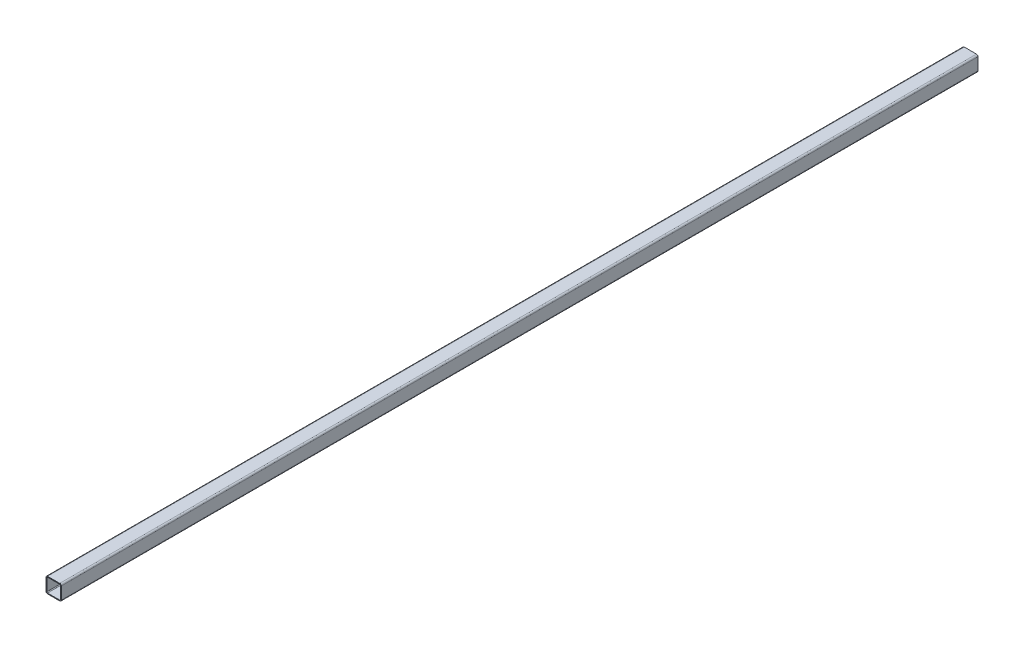
ISO-10303-21;
HEADER;
FILE_DESCRIPTION(('STEP AP214'),'2;1');
FILE_NAME('part.step','',(''),(''),'','','');
FILE_SCHEMA(('AUTOMOTIVE_DESIGN { 1 0 10303 214 1 1 1 1 }'));
ENDSEC;
DATA;
#1=APPLICATION_CONTEXT('core data for automotive mechanical design processes');
#2=APPLICATION_PROTOCOL_DEFINITION('international standard','automotive_design',2000,#1);
#3=PRODUCT_CONTEXT('',#1,'mechanical');
#4=PRODUCT('Part','Part','',(#3));
#5=PRODUCT_RELATED_PRODUCT_CATEGORY('part','',(#4));
#6=PRODUCT_DEFINITION_FORMATION('','',#4);
#7=PRODUCT_DEFINITION_CONTEXT('part definition',#1,'design');
#8=PRODUCT_DEFINITION('design','',#6,#7);
#9=PRODUCT_DEFINITION_SHAPE('','',#8);
#10=(LENGTH_UNIT() NAMED_UNIT(*) SI_UNIT(.MILLI.,.METRE.));
#11=(NAMED_UNIT(*) PLANE_ANGLE_UNIT() SI_UNIT($,.RADIAN.));
#12=(NAMED_UNIT(*) SI_UNIT($,.STERADIAN.) SOLID_ANGLE_UNIT());
#13=UNCERTAINTY_MEASURE_WITH_UNIT(LENGTH_MEASURE(1.E-05),#10,'distance_accuracy_value','');
#14=(GEOMETRIC_REPRESENTATION_CONTEXT(3) GLOBAL_UNCERTAINTY_ASSIGNED_CONTEXT((#13)) GLOBAL_UNIT_ASSIGNED_CONTEXT((#10,
#11,#12)) REPRESENTATION_CONTEXT('',''));
#15=CARTESIAN_POINT('',(0.,0.,0.));
#16=DIRECTION('',(0.,0.,1.));
#17=DIRECTION('',(1.,0.,0.));
#18=AXIS2_PLACEMENT_3D('',#15,#16,#17);
#19=CARTESIAN_POINT('',(-40.,-40.,6000.));
#20=DIRECTION('',(0.,0.,-1.));
#21=DIRECTION('',(-1.,0.,0.));
#22=AXIS2_PLACEMENT_3D('',#19,#20,#21);
#23=CYLINDRICAL_SURFACE('',#22,10.);
#24=CARTESIAN_POINT('',(-40.,-40.,0.));
#25=DIRECTION('',(0.,0.,1.));
#26=DIRECTION('',(1.,0.,0.));
#27=AXIS2_PLACEMENT_3D('',#24,#25,#26);
#28=CIRCLE('',#27,10.);
#29=CARTESIAN_POINT('',(-50.,-40.,0.));
#30=VERTEX_POINT('',#29);
#31=CARTESIAN_POINT('',(-40.,-50.,0.));
#32=VERTEX_POINT('',#31);
#33=EDGE_CURVE('E245',#30,#32,#28,.T.);
#34=ORIENTED_EDGE('',*,*,#33,.T.);
#35=DIRECTION('',(0.,0.,-1.));
#36=VECTOR('',#35,1.);
#37=CARTESIAN_POINT('',(-40.,-50.,6000.));
#38=LINE('',#37,#36);
#39=CARTESIAN_POINT('',(-40.,-50.,6000.));
#40=VERTEX_POINT('',#39);
#41=EDGE_CURVE('E12',#40,#32,#38,.T.);
#42=ORIENTED_EDGE('',*,*,#41,.F.);
#43=CARTESIAN_POINT('',(-40.,-40.,6000.));
#44=DIRECTION('',(0.,0.,1.));
#45=DIRECTION('',(1.,0.,0.));
#46=AXIS2_PLACEMENT_3D('',#43,#44,#45);
#47=CIRCLE('',#46,10.);
#48=CARTESIAN_POINT('',(-50.,-40.,6000.));
#49=VERTEX_POINT('',#48);
#50=EDGE_CURVE('E321',#49,#40,#47,.T.);
#51=ORIENTED_EDGE('',*,*,#50,.F.);
#52=DIRECTION('',(0.,0.,-1.));
#53=VECTOR('',#52,1.);
#54=CARTESIAN_POINT('',(-50.,-40.,6000.));
#55=LINE('',#54,#53);
#56=EDGE_CURVE('E256',#49,#30,#55,.T.);
#57=ORIENTED_EDGE('',*,*,#56,.T.);
#58=EDGE_LOOP('',(#34,#42,#51,#57));
#59=FACE_BOUND('',#58,.T.);
#60=ADVANCED_FACE('F72',(#59),#23,.T.);
#61=CARTESIAN_POINT('',(-40.,-50.,6000.));
#62=DIRECTION('',(0.,1.,0.));
#63=DIRECTION('',(0.,0.,1.));
#64=AXIS2_PLACEMENT_3D('',#61,#62,#63);
#65=PLANE('',#64);
#66=DIRECTION('',(1.,0.,0.));
#67=VECTOR('',#66,1.);
#68=CARTESIAN_POINT('',(-40.,-50.,0.));
#69=LINE('',#68,#67);
#70=CARTESIAN_POINT('',(40.,-50.,0.));
#71=VERTEX_POINT('',#70);
#72=EDGE_CURVE('E247',#32,#71,#69,.T.);
#73=ORIENTED_EDGE('',*,*,#72,.T.);
#74=DIRECTION('',(0.,0.,-1.));
#75=VECTOR('',#74,1.);
#76=CARTESIAN_POINT('',(40.,-50.,6000.));
#77=LINE('',#76,#75);
#78=CARTESIAN_POINT('',(40.,-50.,6000.));
#79=VERTEX_POINT('',#78);
#80=EDGE_CURVE('E83',#79,#71,#77,.T.);
#81=ORIENTED_EDGE('',*,*,#80,.F.);
#82=DIRECTION('',(1.,0.,0.));
#83=VECTOR('',#82,1.);
#84=CARTESIAN_POINT('',(-40.,-50.,6000.));
#85=LINE('',#84,#83);
#86=EDGE_CURVE('E322',#40,#79,#85,.T.);
#87=ORIENTED_EDGE('',*,*,#86,.F.);
#88=ORIENTED_EDGE('',*,*,#41,.T.);
#89=EDGE_LOOP('',(#73,#81,#87,#88));
#90=FACE_BOUND('',#89,.T.);
#91=ADVANCED_FACE('F358',(#90),#65,.F.);
#92=CARTESIAN_POINT('',(40.,-40.,6000.));
#93=DIRECTION('',(0.,0.,-1.));
#94=DIRECTION('',(-1.,0.,0.));
#95=AXIS2_PLACEMENT_3D('',#92,#93,#94);
#96=CYLINDRICAL_SURFACE('',#95,10.);
#97=CARTESIAN_POINT('',(40.,-40.,0.));
#98=DIRECTION('',(0.,0.,1.));
#99=DIRECTION('',(1.,0.,0.));
#100=AXIS2_PLACEMENT_3D('',#97,#98,#99);
#101=CIRCLE('',#100,10.);
#102=CARTESIAN_POINT('',(50.,-40.,0.));
#103=VERTEX_POINT('',#102);
#104=EDGE_CURVE('E246',#71,#103,#101,.T.);
#105=ORIENTED_EDGE('',*,*,#104,.T.);
#106=DIRECTION('',(0.,0.,-1.));
#107=VECTOR('',#106,1.);
#108=CARTESIAN_POINT('',(50.,-40.,6000.));
#109=LINE('',#108,#107);
#110=CARTESIAN_POINT('',(50.,-40.,6000.));
#111=VERTEX_POINT('',#110);
#112=EDGE_CURVE('E262',#111,#103,#109,.T.);
#113=ORIENTED_EDGE('',*,*,#112,.F.);
#114=CARTESIAN_POINT('',(40.,-40.,6000.));
#115=DIRECTION('',(0.,0.,1.));
#116=DIRECTION('',(1.,0.,0.));
#117=AXIS2_PLACEMENT_3D('',#114,#115,#116);
#118=CIRCLE('',#117,10.);
#119=EDGE_CURVE('E324',#79,#111,#118,.T.);
#120=ORIENTED_EDGE('',*,*,#119,.F.);
#121=ORIENTED_EDGE('',*,*,#80,.T.);
#122=EDGE_LOOP('',(#105,#113,#120,#121));
#123=FACE_BOUND('',#122,.T.);
#124=ADVANCED_FACE('F363',(#123),#96,.T.);
#125=CARTESIAN_POINT('',(50.,-40.,6000.));
#126=DIRECTION('',(-1.,0.,0.));
#127=DIRECTION('',(0.,0.,1.));
#128=AXIS2_PLACEMENT_3D('',#125,#126,#127);
#129=PLANE('',#128);
#130=DIRECTION('',(0.,1.,0.));
#131=VECTOR('',#130,1.);
#132=CARTESIAN_POINT('',(50.,-40.,0.));
#133=LINE('',#132,#131);
#134=CARTESIAN_POINT('',(50.,40.,0.));
#135=VERTEX_POINT('',#134);
#136=EDGE_CURVE('E248',#103,#135,#133,.T.);
#137=ORIENTED_EDGE('',*,*,#136,.T.);
#138=DIRECTION('',(0.,0.,-1.));
#139=VECTOR('',#138,1.);
#140=CARTESIAN_POINT('',(50.,40.,6000.));
#141=LINE('',#140,#139);
#142=CARTESIAN_POINT('',(50.,40.,6000.));
#143=VERTEX_POINT('',#142);
#144=EDGE_CURVE('E265',#143,#135,#141,.T.);
#145=ORIENTED_EDGE('',*,*,#144,.F.);
#146=DIRECTION('',(0.,1.,0.));
#147=VECTOR('',#146,1.);
#148=CARTESIAN_POINT('',(50.,-40.,6000.));
#149=LINE('',#148,#147);
#150=EDGE_CURVE('E330',#111,#143,#149,.T.);
#151=ORIENTED_EDGE('',*,*,#150,.F.);
#152=ORIENTED_EDGE('',*,*,#112,.T.);
#153=EDGE_LOOP('',(#137,#145,#151,#152));
#154=FACE_BOUND('',#153,.T.);
#155=ADVANCED_FACE('F335',(#154),#129,.F.);
#156=CARTESIAN_POINT('',(40.,40.,6000.));
#157=DIRECTION('',(0.,0.,-1.));
#158=DIRECTION('',(-1.,0.,0.));
#159=AXIS2_PLACEMENT_3D('',#156,#157,#158);
#160=CYLINDRICAL_SURFACE('',#159,10.);
#161=CARTESIAN_POINT('',(40.,40.,0.));
#162=DIRECTION('',(0.,0.,1.));
#163=DIRECTION('',(1.,0.,0.));
#164=AXIS2_PLACEMENT_3D('',#161,#162,#163);
#165=CIRCLE('',#164,10.);
#166=CARTESIAN_POINT('',(40.,50.,0.));
#167=VERTEX_POINT('',#166);
#168=EDGE_CURVE('E254',#135,#167,#165,.T.);
#169=ORIENTED_EDGE('',*,*,#168,.T.);
#170=DIRECTION('',(0.,0.,-1.));
#171=VECTOR('',#170,1.);
#172=CARTESIAN_POINT('',(40.,50.,6000.));
#173=LINE('',#172,#171);
#174=CARTESIAN_POINT('',(40.,50.,6000.));
#175=VERTEX_POINT('',#174);
#176=EDGE_CURVE('E208',#175,#167,#173,.T.);
#177=ORIENTED_EDGE('',*,*,#176,.F.);
#178=CARTESIAN_POINT('',(40.,40.,6000.));
#179=DIRECTION('',(0.,0.,1.));
#180=DIRECTION('',(1.,0.,0.));
#181=AXIS2_PLACEMENT_3D('',#178,#179,#180);
#182=CIRCLE('',#181,10.);
#183=EDGE_CURVE('E202',#143,#175,#182,.T.);
#184=ORIENTED_EDGE('',*,*,#183,.F.);
#185=ORIENTED_EDGE('',*,*,#144,.T.);
#186=EDGE_LOOP('',(#169,#177,#184,#185));
#187=FACE_BOUND('',#186,.T.);
#188=ADVANCED_FACE('F340',(#187),#160,.T.);
#189=CARTESIAN_POINT('',(40.,50.,6000.));
#190=DIRECTION('',(0.,-1.,0.));
#191=DIRECTION('',(0.,0.,-1.));
#192=AXIS2_PLACEMENT_3D('',#189,#190,#191);
#193=PLANE('',#192);
#194=DIRECTION('',(-1.,0.,0.));
#195=VECTOR('',#194,1.);
#196=CARTESIAN_POINT('',(40.,50.,0.));
#197=LINE('',#196,#195);
#198=CARTESIAN_POINT('',(-40.,50.,0.));
#199=VERTEX_POINT('',#198);
#200=EDGE_CURVE('E206',#167,#199,#197,.T.);
#201=ORIENTED_EDGE('',*,*,#200,.T.);
#202=DIRECTION('',(0.,0.,-1.));
#203=VECTOR('',#202,1.);
#204=CARTESIAN_POINT('',(-40.,50.,6000.));
#205=LINE('',#204,#203);
#206=CARTESIAN_POINT('',(-40.,50.,6000.));
#207=VERTEX_POINT('',#206);
#208=EDGE_CURVE('E207',#207,#199,#205,.T.);
#209=ORIENTED_EDGE('',*,*,#208,.F.);
#210=DIRECTION('',(-1.,0.,0.));
#211=VECTOR('',#210,1.);
#212=CARTESIAN_POINT('',(40.,50.,6000.));
#213=LINE('',#212,#211);
#214=EDGE_CURVE('E193',#175,#207,#213,.T.);
#215=ORIENTED_EDGE('',*,*,#214,.F.);
#216=ORIENTED_EDGE('',*,*,#176,.T.);
#217=EDGE_LOOP('',(#201,#209,#215,#216));
#218=FACE_BOUND('',#217,.T.);
#219=ADVANCED_FACE('F209',(#218),#193,.F.);
#220=CARTESIAN_POINT('',(-40.,40.,6000.));
#221=DIRECTION('',(0.,0.,-1.));
#222=DIRECTION('',(-1.,0.,0.));
#223=AXIS2_PLACEMENT_3D('',#220,#221,#222);
#224=CYLINDRICAL_SURFACE('',#223,10.);
#225=CARTESIAN_POINT('',(-40.,40.,0.));
#226=DIRECTION('',(0.,0.,1.));
#227=DIRECTION('',(1.,0.,0.));
#228=AXIS2_PLACEMENT_3D('',#225,#226,#227);
#229=CIRCLE('',#228,10.);
#230=CARTESIAN_POINT('',(-50.,40.,0.));
#231=VERTEX_POINT('',#230);
#232=EDGE_CURVE('E142',#199,#231,#229,.T.);
#233=ORIENTED_EDGE('',*,*,#232,.T.);
#234=DIRECTION('',(0.,0.,-1.));
#235=VECTOR('',#234,1.);
#236=CARTESIAN_POINT('',(-50.,40.,6000.));
#237=LINE('',#236,#235);
#238=CARTESIAN_POINT('',(-50.,40.,6000.));
#239=VERTEX_POINT('',#238);
#240=EDGE_CURVE('E213',#239,#231,#237,.T.);
#241=ORIENTED_EDGE('',*,*,#240,.F.);
#242=CARTESIAN_POINT('',(-40.,40.,6000.));
#243=DIRECTION('',(0.,0.,1.));
#244=DIRECTION('',(1.,0.,0.));
#245=AXIS2_PLACEMENT_3D('',#242,#243,#244);
#246=CIRCLE('',#245,10.);
#247=EDGE_CURVE('E196',#207,#239,#246,.T.);
#248=ORIENTED_EDGE('',*,*,#247,.F.);
#249=ORIENTED_EDGE('',*,*,#208,.T.);
#250=EDGE_LOOP('',(#233,#241,#248,#249));
#251=FACE_BOUND('',#250,.T.);
#252=ADVANCED_FACE('F211',(#251),#224,.T.);
#253=CARTESIAN_POINT('',(-40.,-40.,6000.));
#254=DIRECTION('',(0.,0.,-1.));
#255=DIRECTION('',(-1.,0.,0.));
#256=AXIS2_PLACEMENT_3D('',#253,#254,#255);
#257=CYLINDRICAL_SURFACE('',#256,5.);
#258=CARTESIAN_POINT('',(-40.,-40.,0.));
#259=DIRECTION('',(0.,0.,1.));
#260=DIRECTION('',(1.,0.,0.));
#261=AXIS2_PLACEMENT_3D('',#258,#259,#260);
#262=CIRCLE('',#261,5.);
#263=CARTESIAN_POINT('',(-45.,-40.,0.));
#264=VERTEX_POINT('',#263);
#265=CARTESIAN_POINT('',(-40.,-45.,0.));
#266=VERTEX_POINT('',#265);
#267=EDGE_CURVE('E219',#264,#266,#262,.T.);
#268=ORIENTED_EDGE('',*,*,#267,.F.);
#269=DIRECTION('',(0.,0.,-1.));
#270=VECTOR('',#269,1.);
#271=CARTESIAN_POINT('',(-45.,-40.,6000.));
#272=LINE('',#271,#270);
#273=CARTESIAN_POINT('',(-45.,-40.,6000.));
#274=VERTEX_POINT('',#273);
#275=EDGE_CURVE('E73',#274,#264,#272,.T.);
#276=ORIENTED_EDGE('',*,*,#275,.F.);
#277=CARTESIAN_POINT('',(-40.,-40.,6000.));
#278=DIRECTION('',(0.,0.,1.));
#279=DIRECTION('',(1.,0.,0.));
#280=AXIS2_PLACEMENT_3D('',#277,#278,#279);
#281=CIRCLE('',#280,5.);
#282=CARTESIAN_POINT('',(-40.,-45.,6000.));
#283=VERTEX_POINT('',#282);
#284=EDGE_CURVE('E257',#274,#283,#281,.T.);
#285=ORIENTED_EDGE('',*,*,#284,.T.);
#286=DIRECTION('',(0.,0.,-1.));
#287=VECTOR('',#286,1.);
#288=CARTESIAN_POINT('',(-40.,-45.,6000.));
#289=LINE('',#288,#287);
#290=EDGE_CURVE('E214',#283,#266,#289,.T.);
#291=ORIENTED_EDGE('',*,*,#290,.T.);
#292=EDGE_LOOP('',(#268,#276,#285,#291));
#293=FACE_BOUND('',#292,.T.);
#294=ADVANCED_FACE('F75',(#293),#257,.F.);
#295=CARTESIAN_POINT('',(-45.,40.,6000.));
#296=DIRECTION('',(1.,0.,0.));
#297=DIRECTION('',(0.,0.,-1.));
#298=AXIS2_PLACEMENT_3D('',#295,#296,#297);
#299=PLANE('',#298);
#300=DIRECTION('',(0.,-1.,0.));
#301=VECTOR('',#300,1.);
#302=CARTESIAN_POINT('',(-45.,40.,0.));
#303=LINE('',#302,#301);
#304=CARTESIAN_POINT('',(-45.,40.,0.));
#305=VERTEX_POINT('',#304);
#306=EDGE_CURVE('E225',#305,#264,#303,.T.);
#307=ORIENTED_EDGE('',*,*,#306,.F.);
#308=DIRECTION('',(0.,0.,-1.));
#309=VECTOR('',#308,1.);
#310=CARTESIAN_POINT('',(-45.,40.,6000.));
#311=LINE('',#310,#309);
#312=CARTESIAN_POINT('',(-45.,40.,6000.));
#313=VERTEX_POINT('',#312);
#314=EDGE_CURVE('E279',#313,#305,#311,.T.);
#315=ORIENTED_EDGE('',*,*,#314,.F.);
#316=DIRECTION('',(0.,-1.,0.));
#317=VECTOR('',#316,1.);
#318=CARTESIAN_POINT('',(-45.,40.,6000.));
#319=LINE('',#318,#317);
#320=EDGE_CURVE('E286',#313,#274,#319,.T.);
#321=ORIENTED_EDGE('',*,*,#320,.T.);
#322=ORIENTED_EDGE('',*,*,#275,.T.);
#323=EDGE_LOOP('',(#307,#315,#321,#322));
#324=FACE_BOUND('',#323,.T.);
#325=ADVANCED_FACE('F289',(#324),#299,.T.);
#326=CARTESIAN_POINT('',(-40.,40.,6000.));
#327=DIRECTION('',(0.,0.,-1.));
#328=DIRECTION('',(-1.,0.,0.));
#329=AXIS2_PLACEMENT_3D('',#326,#327,#328);
#330=CYLINDRICAL_SURFACE('',#329,5.);
#331=CARTESIAN_POINT('',(-40.,40.,0.));
#332=DIRECTION('',(0.,0.,1.));
#333=DIRECTION('',(1.,0.,0.));
#334=AXIS2_PLACEMENT_3D('',#331,#332,#333);
#335=CIRCLE('',#334,5.);
#336=CARTESIAN_POINT('',(-40.,45.,0.));
#337=VERTEX_POINT('',#336);
#338=EDGE_CURVE('E224',#337,#305,#335,.T.);
#339=ORIENTED_EDGE('',*,*,#338,.F.);
#340=DIRECTION('',(0.,0.,-1.));
#341=VECTOR('',#340,1.);
#342=CARTESIAN_POINT('',(-40.,45.,6000.));
#343=LINE('',#342,#341);
#344=CARTESIAN_POINT('',(-40.,45.,6000.));
#345=VERTEX_POINT('',#344);
#346=EDGE_CURVE('E278',#345,#337,#343,.T.);
#347=ORIENTED_EDGE('',*,*,#346,.F.);
#348=CARTESIAN_POINT('',(-40.,40.,6000.));
#349=DIRECTION('',(0.,0.,1.));
#350=DIRECTION('',(1.,0.,0.));
#351=AXIS2_PLACEMENT_3D('',#348,#349,#350);
#352=CIRCLE('',#351,5.);
#353=EDGE_CURVE('E299',#345,#313,#352,.T.);
#354=ORIENTED_EDGE('',*,*,#353,.T.);
#355=ORIENTED_EDGE('',*,*,#314,.T.);
#356=EDGE_LOOP('',(#339,#347,#354,#355));
#357=FACE_BOUND('',#356,.T.);
#358=ADVANCED_FACE('F293',(#357),#330,.F.);
#359=CARTESIAN_POINT('',(40.,45.,6000.));
#360=DIRECTION('',(0.,-1.,0.));
#361=DIRECTION('',(0.,0.,-1.));
#362=AXIS2_PLACEMENT_3D('',#359,#360,#361);
#363=PLANE('',#362);
#364=DIRECTION('',(-1.,0.,0.));
#365=VECTOR('',#364,1.);
#366=CARTESIAN_POINT('',(40.,45.,0.));
#367=LINE('',#366,#365);
#368=CARTESIAN_POINT('',(40.,45.,0.));
#369=VERTEX_POINT('',#368);
#370=EDGE_CURVE('E228',#369,#337,#367,.T.);
#371=ORIENTED_EDGE('',*,*,#370,.F.);
#372=DIRECTION('',(0.,0.,-1.));
#373=VECTOR('',#372,1.);
#374=CARTESIAN_POINT('',(40.,45.,6000.));
#375=LINE('',#374,#373);
#376=CARTESIAN_POINT('',(40.,45.,6000.));
#377=VERTEX_POINT('',#376);
#378=EDGE_CURVE('E280',#377,#369,#375,.T.);
#379=ORIENTED_EDGE('',*,*,#378,.F.);
#380=DIRECTION('',(-1.,0.,0.));
#381=VECTOR('',#380,1.);
#382=CARTESIAN_POINT('',(40.,45.,6000.));
#383=LINE('',#382,#381);
#384=EDGE_CURVE('E301',#377,#345,#383,.T.);
#385=ORIENTED_EDGE('',*,*,#384,.T.);
#386=ORIENTED_EDGE('',*,*,#346,.T.);
#387=EDGE_LOOP('',(#371,#379,#385,#386));
#388=FACE_BOUND('',#387,.T.);
#389=ADVANCED_FACE('F308',(#388),#363,.T.);
#390=CARTESIAN_POINT('',(40.,40.,6000.));
#391=DIRECTION('',(0.,0.,-1.));
#392=DIRECTION('',(-1.,0.,0.));
#393=AXIS2_PLACEMENT_3D('',#390,#391,#392);
#394=CYLINDRICAL_SURFACE('',#393,5.);
#395=CARTESIAN_POINT('',(40.,40.,0.));
#396=DIRECTION('',(0.,0.,1.));
#397=DIRECTION('',(1.,0.,0.));
#398=AXIS2_PLACEMENT_3D('',#395,#396,#397);
#399=CIRCLE('',#398,5.);
#400=CARTESIAN_POINT('',(45.,40.,0.));
#401=VERTEX_POINT('',#400);
#402=EDGE_CURVE('E231',#401,#369,#399,.T.);
#403=ORIENTED_EDGE('',*,*,#402,.F.);
#404=DIRECTION('',(0.,0.,-1.));
#405=VECTOR('',#404,1.);
#406=CARTESIAN_POINT('',(45.,40.,6000.));
#407=LINE('',#406,#405);
#408=CARTESIAN_POINT('',(45.,40.,6000.));
#409=VERTEX_POINT('',#408);
#410=EDGE_CURVE('E274',#409,#401,#407,.T.);
#411=ORIENTED_EDGE('',*,*,#410,.F.);
#412=CARTESIAN_POINT('',(40.,40.,6000.));
#413=DIRECTION('',(0.,0.,1.));
#414=DIRECTION('',(1.,0.,0.));
#415=AXIS2_PLACEMENT_3D('',#412,#413,#414);
#416=CIRCLE('',#415,5.);
#417=EDGE_CURVE('E310',#409,#377,#416,.T.);
#418=ORIENTED_EDGE('',*,*,#417,.T.);
#419=ORIENTED_EDGE('',*,*,#378,.T.);
#420=EDGE_LOOP('',(#403,#411,#418,#419));
#421=FACE_BOUND('',#420,.T.);
#422=ADVANCED_FACE('F371',(#421),#394,.F.);
#423=CARTESIAN_POINT('',(45.,-40.,6000.));
#424=DIRECTION('',(-1.,0.,0.));
#425=DIRECTION('',(0.,0.,1.));
#426=AXIS2_PLACEMENT_3D('',#423,#424,#425);
#427=PLANE('',#426);
#428=DIRECTION('',(0.,1.,0.));
#429=VECTOR('',#428,1.);
#430=CARTESIAN_POINT('',(45.,-40.,0.));
#431=LINE('',#430,#429);
#432=CARTESIAN_POINT('',(45.,-40.,0.));
#433=VERTEX_POINT('',#432);
#434=EDGE_CURVE('E233',#433,#401,#431,.T.);
#435=ORIENTED_EDGE('',*,*,#434,.F.);
#436=DIRECTION('',(0.,0.,-1.));
#437=VECTOR('',#436,1.);
#438=CARTESIAN_POINT('',(45.,-40.,6000.));
#439=LINE('',#438,#437);
#440=CARTESIAN_POINT('',(45.,-40.,6000.));
#441=VERTEX_POINT('',#440);
#442=EDGE_CURVE('E273',#441,#433,#439,.T.);
#443=ORIENTED_EDGE('',*,*,#442,.F.);
#444=DIRECTION('',(0.,1.,0.));
#445=VECTOR('',#444,1.);
#446=CARTESIAN_POINT('',(45.,-40.,6000.));
#447=LINE('',#446,#445);
#448=EDGE_CURVE('E309',#441,#409,#447,.T.);
#449=ORIENTED_EDGE('',*,*,#448,.T.);
#450=ORIENTED_EDGE('',*,*,#410,.T.);
#451=EDGE_LOOP('',(#435,#443,#449,#450));
#452=FACE_BOUND('',#451,.T.);
#453=ADVANCED_FACE('F369',(#452),#427,.T.);
#454=CARTESIAN_POINT('',(40.,-40.,6000.));
#455=DIRECTION('',(0.,0.,-1.));
#456=DIRECTION('',(-1.,0.,0.));
#457=AXIS2_PLACEMENT_3D('',#454,#455,#456);
#458=CYLINDRICAL_SURFACE('',#457,5.);
#459=CARTESIAN_POINT('',(40.,-40.,0.));
#460=DIRECTION('',(0.,0.,1.));
#461=DIRECTION('',(1.,0.,0.));
#462=AXIS2_PLACEMENT_3D('',#459,#460,#461);
#463=CIRCLE('',#462,5.);
#464=CARTESIAN_POINT('',(40.,-45.,0.));
#465=VERTEX_POINT('',#464);
#466=EDGE_CURVE('E240',#465,#433,#463,.T.);
#467=ORIENTED_EDGE('',*,*,#466,.F.);
#468=DIRECTION('',(0.,0.,-1.));
#469=VECTOR('',#468,1.);
#470=CARTESIAN_POINT('',(40.,-45.,6000.));
#471=LINE('',#470,#469);
#472=CARTESIAN_POINT('',(40.,-45.,6000.));
#473=VERTEX_POINT('',#472);
#474=EDGE_CURVE('E271',#473,#465,#471,.T.);
#475=ORIENTED_EDGE('',*,*,#474,.F.);
#476=CARTESIAN_POINT('',(40.,-40.,6000.));
#477=DIRECTION('',(0.,0.,1.));
#478=DIRECTION('',(1.,0.,0.));
#479=AXIS2_PLACEMENT_3D('',#476,#477,#478);
#480=CIRCLE('',#479,5.);
#481=EDGE_CURVE('E314',#473,#441,#480,.T.);
#482=ORIENTED_EDGE('',*,*,#481,.T.);
#483=ORIENTED_EDGE('',*,*,#442,.T.);
#484=EDGE_LOOP('',(#467,#475,#482,#483));
#485=FACE_BOUND('',#484,.T.);
#486=ADVANCED_FACE('F355',(#485),#458,.F.);
#487=CARTESIAN_POINT('',(-40.,-45.,6000.));
#488=DIRECTION('',(0.,1.,0.));
#489=DIRECTION('',(0.,0.,1.));
#490=AXIS2_PLACEMENT_3D('',#487,#488,#489);
#491=PLANE('',#490);
#492=DIRECTION('',(1.,0.,0.));
#493=VECTOR('',#492,1.);
#494=CARTESIAN_POINT('',(-40.,-45.,0.));
#495=LINE('',#494,#493);
#496=EDGE_CURVE('E238',#266,#465,#495,.T.);
#497=ORIENTED_EDGE('',*,*,#496,.F.);
#498=ORIENTED_EDGE('',*,*,#290,.F.);
#499=DIRECTION('',(1.,0.,0.));
#500=VECTOR('',#499,1.);
#501=CARTESIAN_POINT('',(-40.,-45.,6000.));
#502=LINE('',#501,#500);
#503=EDGE_CURVE('E318',#283,#473,#502,.T.);
#504=ORIENTED_EDGE('',*,*,#503,.T.);
#505=ORIENTED_EDGE('',*,*,#474,.T.);
#506=EDGE_LOOP('',(#497,#498,#504,#505));
#507=FACE_BOUND('',#506,.T.);
#508=ADVANCED_FACE('F343',(#507),#491,.T.);
#509=CARTESIAN_POINT('',(-50.,40.,6000.));
#510=DIRECTION('',(1.,0.,0.));
#511=DIRECTION('',(0.,0.,-1.));
#512=AXIS2_PLACEMENT_3D('',#509,#510,#511);
#513=PLANE('',#512);
#514=DIRECTION('',(0.,-1.,0.));
#515=VECTOR('',#514,1.);
#516=CARTESIAN_POINT('',(-50.,40.,0.));
#517=LINE('',#516,#515);
#518=EDGE_CURVE('E146',#231,#30,#517,.T.);
#519=ORIENTED_EDGE('',*,*,#518,.T.);
#520=ORIENTED_EDGE('',*,*,#56,.F.);
#521=DIRECTION('',(0.,-1.,0.));
#522=VECTOR('',#521,1.);
#523=CARTESIAN_POINT('',(-50.,40.,6000.));
#524=LINE('',#523,#522);
#525=EDGE_CURVE('E89',#239,#49,#524,.T.);
#526=ORIENTED_EDGE('',*,*,#525,.F.);
#527=ORIENTED_EDGE('',*,*,#240,.T.);
#528=EDGE_LOOP('',(#519,#520,#526,#527));
#529=FACE_BOUND('',#528,.T.);
#530=ADVANCED_FACE('F345',(#529),#513,.F.);
#531=CARTESIAN_POINT('',(-40.,-40.,6000.));
#532=DIRECTION('',(0.,0.,1.));
#533=DIRECTION('',(1.,0.,0.));
#534=AXIS2_PLACEMENT_3D('',#531,#532,#533);
#535=PLANE('',#534);
#536=ORIENTED_EDGE('',*,*,#284,.F.);
#537=ORIENTED_EDGE('',*,*,#320,.F.);
#538=ORIENTED_EDGE('',*,*,#353,.F.);
#539=ORIENTED_EDGE('',*,*,#384,.F.);
#540=ORIENTED_EDGE('',*,*,#417,.F.);
#541=ORIENTED_EDGE('',*,*,#448,.F.);
#542=ORIENTED_EDGE('',*,*,#481,.F.);
#543=ORIENTED_EDGE('',*,*,#503,.F.);
#544=EDGE_LOOP('',(#536,#537,#538,#539,#540,#541,#542,#543));
#545=FACE_BOUND('',#544,.T.);
#546=ORIENTED_EDGE('',*,*,#50,.T.);
#547=ORIENTED_EDGE('',*,*,#86,.T.);
#548=ORIENTED_EDGE('',*,*,#119,.T.);
#549=ORIENTED_EDGE('',*,*,#150,.T.);
#550=ORIENTED_EDGE('',*,*,#183,.T.);
#551=ORIENTED_EDGE('',*,*,#214,.T.);
#552=ORIENTED_EDGE('',*,*,#247,.T.);
#553=ORIENTED_EDGE('',*,*,#525,.T.);
#554=EDGE_LOOP('',(#546,#547,#548,#549,#550,#551,#552,#553));
#555=FACE_BOUND('',#554,.T.);
#556=ADVANCED_FACE('F199',(#545,#555),#535,.T.);
#557=CARTESIAN_POINT('',(-40.,-40.,0.));
#558=DIRECTION('',(0.,0.,1.));
#559=DIRECTION('',(1.,0.,0.));
#560=AXIS2_PLACEMENT_3D('',#557,#558,#559);
#561=PLANE('',#560);
#562=ORIENTED_EDGE('',*,*,#267,.T.);
#563=ORIENTED_EDGE('',*,*,#496,.T.);
#564=ORIENTED_EDGE('',*,*,#466,.T.);
#565=ORIENTED_EDGE('',*,*,#434,.T.);
#566=ORIENTED_EDGE('',*,*,#402,.T.);
#567=ORIENTED_EDGE('',*,*,#370,.T.);
#568=ORIENTED_EDGE('',*,*,#338,.T.);
#569=ORIENTED_EDGE('',*,*,#306,.T.);
#570=EDGE_LOOP('',(#562,#563,#564,#565,#566,#567,#568,#569));
#571=FACE_BOUND('',#570,.T.);
#572=ORIENTED_EDGE('',*,*,#33,.F.);
#573=ORIENTED_EDGE('',*,*,#518,.F.);
#574=ORIENTED_EDGE('',*,*,#232,.F.);
#575=ORIENTED_EDGE('',*,*,#200,.F.);
#576=ORIENTED_EDGE('',*,*,#168,.F.);
#577=ORIENTED_EDGE('',*,*,#136,.F.);
#578=ORIENTED_EDGE('',*,*,#104,.F.);
#579=ORIENTED_EDGE('',*,*,#72,.F.);
#580=EDGE_LOOP('',(#572,#573,#574,#575,#576,#577,#578,#579));
#581=FACE_BOUND('',#580,.T.);
#582=ADVANCED_FACE('F295',(#571,#581),#561,.F.);
#583=CLOSED_SHELL('',(#60,#91,#124,#155,#188,#219,#252,#294,#325,#358,#389,#422,#453,#486,#508,
#530,#556,#582));
#584=MANIFOLD_SOLID_BREP('B2',#583);
#585=ADVANCED_BREP_SHAPE_REPRESENTATION('',(#18,#584),#14);
#586=SHAPE_DEFINITION_REPRESENTATION(#9,#585);
ENDSEC;
END-ISO-10303-21;
